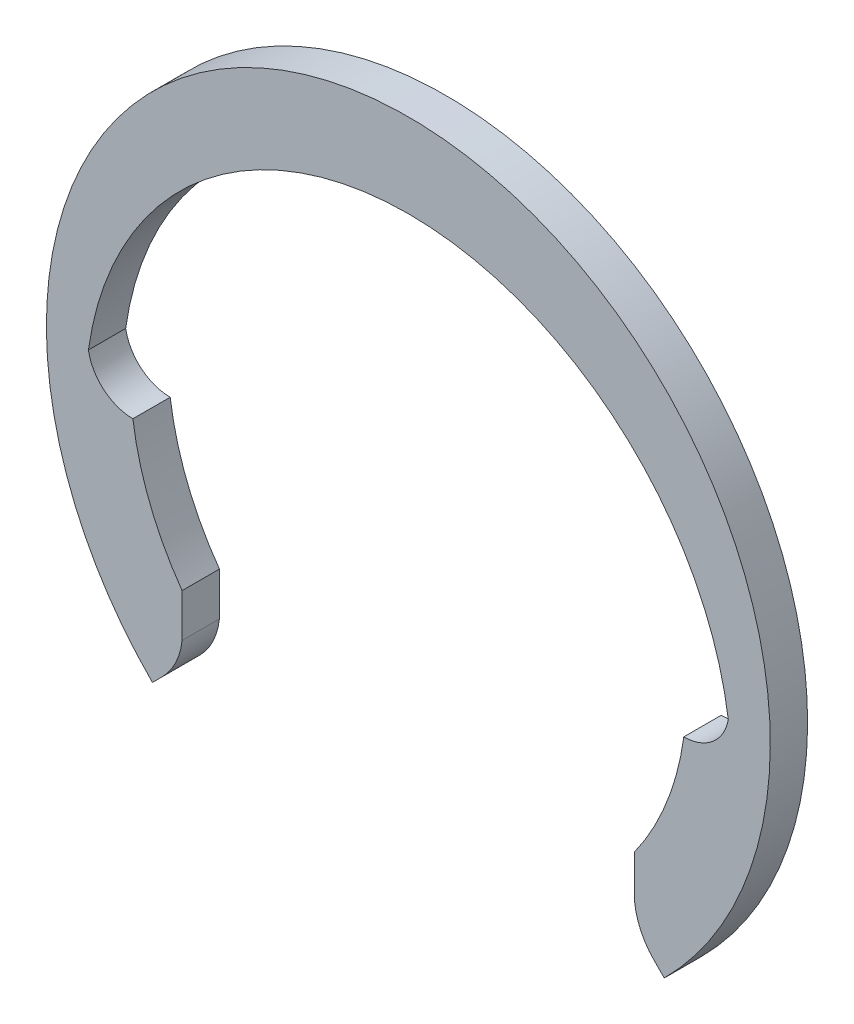
ISO-10303-21;
HEADER;
FILE_DESCRIPTION(('STEP AP214'),'2;1');
FILE_NAME('part.step','',(''),(''),'','','');
FILE_SCHEMA(('AUTOMOTIVE_DESIGN { 1 0 10303 214 1 1 1 1 }'));
ENDSEC;
DATA;
#1=APPLICATION_CONTEXT('core data for automotive mechanical design processes');
#2=APPLICATION_PROTOCOL_DEFINITION('international standard','automotive_design',2000,#1);
#3=PRODUCT_CONTEXT('',#1,'mechanical');
#4=PRODUCT('Part','Part','',(#3));
#5=PRODUCT_RELATED_PRODUCT_CATEGORY('part','',(#4));
#6=PRODUCT_DEFINITION_FORMATION('','',#4);
#7=PRODUCT_DEFINITION_CONTEXT('part definition',#1,'design');
#8=PRODUCT_DEFINITION('design','',#6,#7);
#9=PRODUCT_DEFINITION_SHAPE('','',#8);
#10=(LENGTH_UNIT() NAMED_UNIT(*) SI_UNIT(.MILLI.,.METRE.));
#11=(NAMED_UNIT(*) PLANE_ANGLE_UNIT() SI_UNIT($,.RADIAN.));
#12=(NAMED_UNIT(*) SI_UNIT($,.STERADIAN.) SOLID_ANGLE_UNIT());
#13=UNCERTAINTY_MEASURE_WITH_UNIT(LENGTH_MEASURE(1.E-05),#10,'distance_accuracy_value','');
#14=(GEOMETRIC_REPRESENTATION_CONTEXT(3) GLOBAL_UNCERTAINTY_ASSIGNED_CONTEXT((#13)) GLOBAL_UNIT_ASSIGNED_CONTEXT((#10,
#11,#12)) REPRESENTATION_CONTEXT('',''));
#15=CARTESIAN_POINT('',(0.,0.,0.));
#16=DIRECTION('',(0.,0.,1.));
#17=DIRECTION('',(1.,0.,0.));
#18=AXIS2_PLACEMENT_3D('',#15,#16,#17);
#19=CARTESIAN_POINT('',(-7.38258084954035,0.210931715191452,1.));
#20=DIRECTION('',(0.,0.,-1.));
#21=DIRECTION('',(-1.,0.,0.));
#22=AXIS2_PLACEMENT_3D('',#19,#20,#21);
#23=CYLINDRICAL_SURFACE('',#22,1.21093171519145);
#24=CARTESIAN_POINT('',(-7.38258084954035,0.210931715191452,0.));
#25=DIRECTION('',(0.,0.,-1.));
#26=DIRECTION('',(1.,0.,0.));
#27=AXIS2_PLACEMENT_3D('',#24,#25,#26);
#28=CIRCLE('',#27,1.21093171519145);
#29=CARTESIAN_POINT('',(-7.38258084954035,-0.999999999999998,0.));
#30=VERTEX_POINT('',#29);
#31=CARTESIAN_POINT('',(-8.575,0.,0.));
#32=VERTEX_POINT('',#31);
#33=EDGE_CURVE('E154',#30,#32,#28,.T.);
#34=ORIENTED_EDGE('',*,*,#33,.T.);
#35=DIRECTION('',(0.,0.,-1.));
#36=VECTOR('',#35,1.);
#37=CARTESIAN_POINT('',(-8.575,0.,1.));
#38=LINE('',#37,#36);
#39=CARTESIAN_POINT('',(-8.575,0.,1.));
#40=VERTEX_POINT('',#39);
#41=EDGE_CURVE('E11',#40,#32,#38,.T.);
#42=ORIENTED_EDGE('',*,*,#41,.F.);
#43=CARTESIAN_POINT('',(-7.38258084954035,0.210931715191452,1.));
#44=DIRECTION('',(0.,0.,-1.));
#45=DIRECTION('',(1.,0.,0.));
#46=AXIS2_PLACEMENT_3D('',#43,#44,#45);
#47=CIRCLE('',#46,1.21093171519145);
#48=CARTESIAN_POINT('',(-7.38258084954035,-0.999999999999998,1.));
#49=VERTEX_POINT('',#48);
#50=EDGE_CURVE('E177',#49,#40,#47,.T.);
#51=ORIENTED_EDGE('',*,*,#50,.F.);
#52=DIRECTION('',(0.,0.,-1.));
#53=VECTOR('',#52,1.);
#54=CARTESIAN_POINT('',(-7.38258084954035,-0.999999999999998,1.));
#55=LINE('',#54,#53);
#56=EDGE_CURVE('E150',#49,#30,#55,.T.);
#57=ORIENTED_EDGE('',*,*,#56,.T.);
#58=EDGE_LOOP('',(#34,#42,#51,#57));
#59=FACE_BOUND('',#58,.T.);
#60=ADVANCED_FACE('F34',(#59),#23,.F.);
#61=CARTESIAN_POINT('',(0.,-1.20994127516779,1.));
#62=DIRECTION('',(0.,0.,-1.));
#63=DIRECTION('',(-1.,0.,0.));
#64=AXIS2_PLACEMENT_3D('',#61,#62,#63);
#65=CYLINDRICAL_SURFACE('',#64,8.65994127516779);
#66=CARTESIAN_POINT('',(0.,-1.20994127516779,0.));
#67=DIRECTION('',(0.,0.,-1.));
#68=DIRECTION('',(1.,0.,0.));
#69=AXIS2_PLACEMENT_3D('',#66,#67,#68);
#70=CIRCLE('',#69,8.65994127516779);
#71=CARTESIAN_POINT('',(8.575,0.,0.));
#72=VERTEX_POINT('',#71);
#73=EDGE_CURVE('E157',#32,#72,#70,.T.);
#74=ORIENTED_EDGE('',*,*,#73,.T.);
#75=DIRECTION('',(0.,0.,-1.));
#76=VECTOR('',#75,1.);
#77=CARTESIAN_POINT('',(8.575,0.,1.));
#78=LINE('',#77,#76);
#79=CARTESIAN_POINT('',(8.575,0.,1.));
#80=VERTEX_POINT('',#79);
#81=EDGE_CURVE('E42',#80,#72,#78,.T.);
#82=ORIENTED_EDGE('',*,*,#81,.F.);
#83=CARTESIAN_POINT('',(0.,-1.20994127516779,1.));
#84=DIRECTION('',(0.,0.,-1.));
#85=DIRECTION('',(1.,0.,0.));
#86=AXIS2_PLACEMENT_3D('',#83,#84,#85);
#87=CIRCLE('',#86,8.65994127516779);
#88=EDGE_CURVE('E104',#40,#80,#87,.T.);
#89=ORIENTED_EDGE('',*,*,#88,.F.);
#90=ORIENTED_EDGE('',*,*,#41,.T.);
#91=EDGE_LOOP('',(#74,#82,#89,#90));
#92=FACE_BOUND('',#91,.T.);
#93=ADVANCED_FACE('F254',(#92),#65,.F.);
#94=CARTESIAN_POINT('',(7.38258084954036,0.210931715191454,1.));
#95=DIRECTION('',(0.,0.,-1.));
#96=DIRECTION('',(-1.,0.,0.));
#97=AXIS2_PLACEMENT_3D('',#94,#95,#96);
#98=CYLINDRICAL_SURFACE('',#97,1.21093171519145);
#99=CARTESIAN_POINT('',(7.38258084954036,0.210931715191454,0.));
#100=DIRECTION('',(0.,0.,-1.));
#101=DIRECTION('',(-1.,0.,0.));
#102=AXIS2_PLACEMENT_3D('',#99,#100,#101);
#103=CIRCLE('',#102,1.21093171519145);
#104=CARTESIAN_POINT('',(7.38258084954036,-0.999999999999998,0.));
#105=VERTEX_POINT('',#104);
#106=EDGE_CURVE('E159',#72,#105,#103,.T.);
#107=ORIENTED_EDGE('',*,*,#106,.T.);
#108=DIRECTION('',(0.,0.,-1.));
#109=VECTOR('',#108,1.);
#110=CARTESIAN_POINT('',(7.38258084954036,-0.999999999999998,1.));
#111=LINE('',#110,#109);
#112=CARTESIAN_POINT('',(7.38258084954036,-0.999999999999998,1.));
#113=VERTEX_POINT('',#112);
#114=EDGE_CURVE('E196',#113,#105,#111,.T.);
#115=ORIENTED_EDGE('',*,*,#114,.F.);
#116=CARTESIAN_POINT('',(7.38258084954036,0.210931715191454,1.));
#117=DIRECTION('',(0.,0.,-1.));
#118=DIRECTION('',(-1.,0.,0.));
#119=AXIS2_PLACEMENT_3D('',#116,#117,#118);
#120=CIRCLE('',#119,1.21093171519145);
#121=EDGE_CURVE('E204',#80,#113,#120,.T.);
#122=ORIENTED_EDGE('',*,*,#121,.F.);
#123=ORIENTED_EDGE('',*,*,#81,.T.);
#124=EDGE_LOOP('',(#107,#115,#122,#123));
#125=FACE_BOUND('',#124,.T.);
#126=ADVANCED_FACE('F202',(#125),#98,.F.);
#127=CARTESIAN_POINT('',(0.,0.,1.));
#128=DIRECTION('',(0.,0.,-1.));
#129=DIRECTION('',(-1.,0.,0.));
#130=AXIS2_PLACEMENT_3D('',#127,#128,#129);
#131=CYLINDRICAL_SURFACE('',#130,7.45);
#132=CARTESIAN_POINT('',(0.,0.,0.));
#133=DIRECTION('',(0.,0.,-1.));
#134=DIRECTION('',(-1.,0.,0.));
#135=AXIS2_PLACEMENT_3D('',#132,#133,#134);
#136=CIRCLE('',#135,7.45);
#137=CARTESIAN_POINT('',(6.06344064867466,-4.32864730602989,0.));
#138=VERTEX_POINT('',#137);
#139=EDGE_CURVE('E161',#105,#138,#136,.T.);
#140=ORIENTED_EDGE('',*,*,#139,.T.);
#141=DIRECTION('',(0.,0.,-1.));
#142=VECTOR('',#141,1.);
#143=CARTESIAN_POINT('',(6.06344064867466,-4.32864730602989,1.));
#144=LINE('',#143,#142);
#145=CARTESIAN_POINT('',(6.06344064867466,-4.32864730602989,1.));
#146=VERTEX_POINT('',#145);
#147=EDGE_CURVE('E193',#146,#138,#144,.T.);
#148=ORIENTED_EDGE('',*,*,#147,.F.);
#149=CARTESIAN_POINT('',(0.,0.,1.));
#150=DIRECTION('',(0.,0.,-1.));
#151=DIRECTION('',(-1.,0.,0.));
#152=AXIS2_PLACEMENT_3D('',#149,#150,#151);
#153=CIRCLE('',#152,7.45);
#154=EDGE_CURVE('E221',#113,#146,#153,.T.);
#155=ORIENTED_EDGE('',*,*,#154,.F.);
#156=ORIENTED_EDGE('',*,*,#114,.T.);
#157=EDGE_LOOP('',(#140,#148,#155,#156));
#158=FACE_BOUND('',#157,.T.);
#159=ADVANCED_FACE('F212',(#158),#131,.F.);
#160=CARTESIAN_POINT('',(6.06344064867466,-5.48517620112639,1.));
#161=DIRECTION('',(1.,0.,0.));
#162=DIRECTION('',(0.,0.,-1.));
#163=AXIS2_PLACEMENT_3D('',#160,#161,#162);
#164=PLANE('',#163);
#165=DIRECTION('',(0.,-1.,0.));
#166=VECTOR('',#165,1.);
#167=CARTESIAN_POINT('',(6.06344064867466,-5.48517620112639,0.));
#168=LINE('',#167,#166);
#169=CARTESIAN_POINT('',(6.06344064867466,-5.48517620112639,0.));
#170=VERTEX_POINT('',#169);
#171=EDGE_CURVE('E164',#138,#170,#168,.T.);
#172=ORIENTED_EDGE('',*,*,#171,.T.);
#173=DIRECTION('',(0.,0.,-1.));
#174=VECTOR('',#173,1.);
#175=CARTESIAN_POINT('',(6.06344064867466,-5.48517620112639,1.));
#176=LINE('',#175,#174);
#177=CARTESIAN_POINT('',(6.06344064867466,-5.48517620112639,1.));
#178=VERTEX_POINT('',#177);
#179=EDGE_CURVE('E190',#178,#170,#176,.T.);
#180=ORIENTED_EDGE('',*,*,#179,.F.);
#181=DIRECTION('',(0.,-1.,0.));
#182=VECTOR('',#181,1.);
#183=CARTESIAN_POINT('',(6.06344064867466,-4.90691175357814,1.));
#184=LINE('',#183,#182);
#185=EDGE_CURVE('E218',#146,#178,#184,.T.);
#186=ORIENTED_EDGE('',*,*,#185,.F.);
#187=ORIENTED_EDGE('',*,*,#147,.T.);
#188=EDGE_LOOP('',(#172,#180,#186,#187));
#189=FACE_BOUND('',#188,.T.);
#190=ADVANCED_FACE('F216',(#189),#164,.F.);
#191=CARTESIAN_POINT('',(7.89960221527562,-5.28793925385349,1.));
#192=DIRECTION('',(0.,0.,-1.));
#193=DIRECTION('',(-1.,0.,0.));
#194=AXIS2_PLACEMENT_3D('',#191,#192,#193);
#195=CYLINDRICAL_SURFACE('',#194,1.84672459019531);
#196=CARTESIAN_POINT('',(7.89960221527562,-5.28793925385349,0.));
#197=DIRECTION('',(0.,0.,1.));
#198=DIRECTION('',(1.,0.,0.));
#199=AXIS2_PLACEMENT_3D('',#196,#197,#198);
#200=CIRCLE('',#199,1.84672459019531);
#201=CARTESIAN_POINT('',(6.59377073456457,-6.59377073456454,0.));
#202=VERTEX_POINT('',#201);
#203=EDGE_CURVE('E166',#170,#202,#200,.T.);
#204=ORIENTED_EDGE('',*,*,#203,.T.);
#205=DIRECTION('',(0.,0.,-1.));
#206=VECTOR('',#205,1.);
#207=CARTESIAN_POINT('',(6.59377073456457,-6.59377073456454,1.));
#208=LINE('',#207,#206);
#209=CARTESIAN_POINT('',(6.59377073456457,-6.59377073456454,1.));
#210=VERTEX_POINT('',#209);
#211=EDGE_CURVE('E187',#210,#202,#208,.T.);
#212=ORIENTED_EDGE('',*,*,#211,.F.);
#213=CARTESIAN_POINT('',(7.89960221527562,-5.28793925385349,1.));
#214=DIRECTION('',(0.,0.,1.));
#215=DIRECTION('',(1.,0.,0.));
#216=AXIS2_PLACEMENT_3D('',#213,#214,#215);
#217=CIRCLE('',#216,1.84672459019531);
#218=EDGE_CURVE('E220',#178,#210,#217,.T.);
#219=ORIENTED_EDGE('',*,*,#218,.F.);
#220=ORIENTED_EDGE('',*,*,#179,.T.);
#221=EDGE_LOOP('',(#204,#212,#219,#220));
#222=FACE_BOUND('',#221,.T.);
#223=ADVANCED_FACE('F267',(#222),#195,.T.);
#224=CARTESIAN_POINT('',(6.59377073456457,-6.59377073456454,1.));
#225=DIRECTION('',(0.707106781186547,0.707106781186547,0.));
#226=DIRECTION('',(-0.707106781186548,0.707106781186548,0.));
#227=AXIS2_PLACEMENT_3D('',#224,#225,#226);
#228=PLANE('',#227);
#229=DIRECTION('',(0.707106781186548,-0.707106781186548,0.));
#230=VECTOR('',#229,1.);
#231=CARTESIAN_POINT('',(6.59377073456457,-6.59377073456454,0.));
#232=LINE('',#231,#230);
#233=CARTESIAN_POINT('',(6.85893577750952,-6.8589357775095,0.));
#234=VERTEX_POINT('',#233);
#235=EDGE_CURVE('E168',#202,#234,#232,.T.);
#236=ORIENTED_EDGE('',*,*,#235,.T.);
#237=DIRECTION('',(0.,0.,-1.));
#238=VECTOR('',#237,1.);
#239=CARTESIAN_POINT('',(6.85893577750952,-6.8589357775095,1.));
#240=LINE('',#239,#238);
#241=CARTESIAN_POINT('',(6.85893577750952,-6.8589357775095,1.));
#242=VERTEX_POINT('',#241);
#243=EDGE_CURVE('E184',#242,#234,#240,.T.);
#244=ORIENTED_EDGE('',*,*,#243,.F.);
#245=DIRECTION('',(0.707106781186548,-0.707106781186548,0.));
#246=VECTOR('',#245,1.);
#247=CARTESIAN_POINT('',(6.59377073456457,-6.59377073456454,1.));
#248=LINE('',#247,#246);
#249=EDGE_CURVE('E223',#210,#242,#248,.T.);
#250=ORIENTED_EDGE('',*,*,#249,.F.);
#251=ORIENTED_EDGE('',*,*,#211,.T.);
#252=EDGE_LOOP('',(#236,#244,#250,#251));
#253=FACE_BOUND('',#252,.T.);
#254=ADVANCED_FACE('F270',(#253),#228,.F.);
#255=CARTESIAN_POINT('',(0.,0.,1.));
#256=DIRECTION('',(0.,0.,-1.));
#257=DIRECTION('',(-1.,0.,0.));
#258=AXIS2_PLACEMENT_3D('',#255,#256,#257);
#259=CYLINDRICAL_SURFACE('',#258,9.7);
#260=CARTESIAN_POINT('',(0.,0.,0.));
#261=DIRECTION('',(0.,0.,1.));
#262=DIRECTION('',(1.,0.,0.));
#263=AXIS2_PLACEMENT_3D('',#260,#261,#262);
#264=CIRCLE('',#263,9.7);
#265=CARTESIAN_POINT('',(-6.85893577750952,-6.8589357775095,0.));
#266=VERTEX_POINT('',#265);
#267=EDGE_CURVE('E170',#234,#266,#264,.T.);
#268=ORIENTED_EDGE('',*,*,#267,.T.);
#269=DIRECTION('',(0.,0.,-1.));
#270=VECTOR('',#269,1.);
#271=CARTESIAN_POINT('',(-6.85893577750952,-6.8589357775095,1.));
#272=LINE('',#271,#270);
#273=CARTESIAN_POINT('',(-6.85893577750952,-6.8589357775095,1.));
#274=VERTEX_POINT('',#273);
#275=EDGE_CURVE('E181',#274,#266,#272,.T.);
#276=ORIENTED_EDGE('',*,*,#275,.F.);
#277=CARTESIAN_POINT('',(0.,0.,1.));
#278=DIRECTION('',(0.,0.,1.));
#279=DIRECTION('',(1.,0.,0.));
#280=AXIS2_PLACEMENT_3D('',#277,#278,#279);
#281=CIRCLE('',#280,9.7);
#282=EDGE_CURVE('E229',#242,#274,#281,.T.);
#283=ORIENTED_EDGE('',*,*,#282,.F.);
#284=ORIENTED_EDGE('',*,*,#243,.T.);
#285=EDGE_LOOP('',(#268,#276,#283,#284));
#286=FACE_BOUND('',#285,.T.);
#287=ADVANCED_FACE('F235',(#286),#259,.T.);
#288=CARTESIAN_POINT('',(-6.59377073456456,-6.59377073456454,1.));
#289=DIRECTION('',(-0.707106781186547,0.707106781186547,0.));
#290=DIRECTION('',(-0.707106781186548,-0.707106781186548,0.));
#291=AXIS2_PLACEMENT_3D('',#288,#289,#290);
#292=PLANE('',#291);
#293=DIRECTION('',(0.707106781186548,0.707106781186548,0.));
#294=VECTOR('',#293,1.);
#295=CARTESIAN_POINT('',(-6.59377073456456,-6.59377073456454,0.));
#296=LINE('',#295,#294);
#297=CARTESIAN_POINT('',(-6.59377073456456,-6.59377073456454,0.));
#298=VERTEX_POINT('',#297);
#299=EDGE_CURVE('E172',#266,#298,#296,.T.);
#300=ORIENTED_EDGE('',*,*,#299,.T.);
#301=DIRECTION('',(0.,0.,-1.));
#302=VECTOR('',#301,1.);
#303=CARTESIAN_POINT('',(-6.59377073456456,-6.59377073456454,1.));
#304=LINE('',#303,#302);
#305=CARTESIAN_POINT('',(-6.59377073456456,-6.59377073456454,1.));
#306=VERTEX_POINT('',#305);
#307=EDGE_CURVE('E145',#306,#298,#304,.T.);
#308=ORIENTED_EDGE('',*,*,#307,.F.);
#309=DIRECTION('',(0.707106781186548,0.707106781186548,0.));
#310=VECTOR('',#309,1.);
#311=CARTESIAN_POINT('',(-6.59377073456456,-6.59377073456454,1.));
#312=LINE('',#311,#310);
#313=EDGE_CURVE('E135',#274,#306,#312,.T.);
#314=ORIENTED_EDGE('',*,*,#313,.F.);
#315=ORIENTED_EDGE('',*,*,#275,.T.);
#316=EDGE_LOOP('',(#300,#308,#314,#315));
#317=FACE_BOUND('',#316,.T.);
#318=ADVANCED_FACE('F239',(#317),#292,.F.);
#319=CARTESIAN_POINT('',(-7.89960221527562,-5.28793925385349,1.));
#320=DIRECTION('',(0.,0.,-1.));
#321=DIRECTION('',(-1.,0.,0.));
#322=AXIS2_PLACEMENT_3D('',#319,#320,#321);
#323=CYLINDRICAL_SURFACE('',#322,1.84672459019531);
#324=CARTESIAN_POINT('',(-7.89960221527562,-5.28793925385349,0.));
#325=DIRECTION('',(0.,0.,1.));
#326=DIRECTION('',(-1.,0.,0.));
#327=AXIS2_PLACEMENT_3D('',#324,#325,#326);
#328=CIRCLE('',#327,1.84672459019531);
#329=CARTESIAN_POINT('',(-6.06344064867465,-5.48517620112639,0.));
#330=VERTEX_POINT('',#329);
#331=EDGE_CURVE('E144',#298,#330,#328,.T.);
#332=ORIENTED_EDGE('',*,*,#331,.T.);
#333=DIRECTION('',(0.,0.,-1.));
#334=VECTOR('',#333,1.);
#335=CARTESIAN_POINT('',(-6.06344064867465,-5.48517620112639,1.));
#336=LINE('',#335,#334);
#337=CARTESIAN_POINT('',(-6.06344064867465,-5.48517620112639,1.));
#338=VERTEX_POINT('',#337);
#339=EDGE_CURVE('E141',#338,#330,#336,.T.);
#340=ORIENTED_EDGE('',*,*,#339,.F.);
#341=CARTESIAN_POINT('',(-7.89960221527562,-5.28793925385349,1.));
#342=DIRECTION('',(0.,0.,1.));
#343=DIRECTION('',(-1.,0.,0.));
#344=AXIS2_PLACEMENT_3D('',#341,#342,#343);
#345=CIRCLE('',#344,1.84672459019531);
#346=EDGE_CURVE('E129',#306,#338,#345,.T.);
#347=ORIENTED_EDGE('',*,*,#346,.F.);
#348=ORIENTED_EDGE('',*,*,#307,.T.);
#349=EDGE_LOOP('',(#332,#340,#347,#348));
#350=FACE_BOUND('',#349,.T.);
#351=ADVANCED_FACE('F142',(#350),#323,.T.);
#352=CARTESIAN_POINT('',(-6.06344064867465,-4.90691175357814,1.));
#353=DIRECTION('',(-1.,0.,0.));
#354=DIRECTION('',(0.,0.,1.));
#355=AXIS2_PLACEMENT_3D('',#352,#353,#354);
#356=PLANE('',#355);
#357=DIRECTION('',(0.,1.,0.));
#358=VECTOR('',#357,1.);
#359=CARTESIAN_POINT('',(-6.06344064867465,-4.90691175357814,0.));
#360=LINE('',#359,#358);
#361=CARTESIAN_POINT('',(-6.06344064867465,-4.3286473060299,0.));
#362=VERTEX_POINT('',#361);
#363=EDGE_CURVE('E90',#330,#362,#360,.T.);
#364=ORIENTED_EDGE('',*,*,#363,.T.);
#365=DIRECTION('',(0.,0.,-1.));
#366=VECTOR('',#365,1.);
#367=CARTESIAN_POINT('',(-6.06344064867465,-4.3286473060299,1.));
#368=LINE('',#367,#366);
#369=CARTESIAN_POINT('',(-6.06344064867465,-4.3286473060299,1.));
#370=VERTEX_POINT('',#369);
#371=EDGE_CURVE('E146',#370,#362,#368,.T.);
#372=ORIENTED_EDGE('',*,*,#371,.F.);
#373=DIRECTION('',(0.,1.,0.));
#374=VECTOR('',#373,1.);
#375=CARTESIAN_POINT('',(-6.06344064867465,-5.48517620112639,1.));
#376=LINE('',#375,#374);
#377=EDGE_CURVE('E133',#338,#370,#376,.T.);
#378=ORIENTED_EDGE('',*,*,#377,.F.);
#379=ORIENTED_EDGE('',*,*,#339,.T.);
#380=EDGE_LOOP('',(#364,#372,#378,#379));
#381=FACE_BOUND('',#380,.T.);
#382=ADVANCED_FACE('F148',(#381),#356,.F.);
#383=CARTESIAN_POINT('',(0.,0.,1.));
#384=DIRECTION('',(0.,0.,-1.));
#385=DIRECTION('',(-1.,0.,0.));
#386=AXIS2_PLACEMENT_3D('',#383,#384,#385);
#387=CYLINDRICAL_SURFACE('',#386,7.45);
#388=CARTESIAN_POINT('',(0.,0.,0.));
#389=DIRECTION('',(0.,0.,-1.));
#390=DIRECTION('',(1.,0.,0.));
#391=AXIS2_PLACEMENT_3D('',#388,#389,#390);
#392=CIRCLE('',#391,7.45);
#393=EDGE_CURVE('E96',#362,#30,#392,.T.);
#394=ORIENTED_EDGE('',*,*,#393,.T.);
#395=ORIENTED_EDGE('',*,*,#56,.F.);
#396=CARTESIAN_POINT('',(0.,0.,1.));
#397=DIRECTION('',(0.,0.,-1.));
#398=DIRECTION('',(1.,0.,0.));
#399=AXIS2_PLACEMENT_3D('',#396,#397,#398);
#400=CIRCLE('',#399,7.45);
#401=EDGE_CURVE('E50',#370,#49,#400,.T.);
#402=ORIENTED_EDGE('',*,*,#401,.F.);
#403=ORIENTED_EDGE('',*,*,#371,.T.);
#404=EDGE_LOOP('',(#394,#395,#402,#403));
#405=FACE_BOUND('',#404,.T.);
#406=ADVANCED_FACE('F243',(#405),#387,.F.);
#407=CARTESIAN_POINT('',(-7.38258084954035,0.210931715191452,1.));
#408=DIRECTION('',(0.,0.,1.));
#409=DIRECTION('',(1.,0.,0.));
#410=AXIS2_PLACEMENT_3D('',#407,#408,#409);
#411=PLANE('',#410);
#412=ORIENTED_EDGE('',*,*,#50,.T.);
#413=ORIENTED_EDGE('',*,*,#88,.T.);
#414=ORIENTED_EDGE('',*,*,#121,.T.);
#415=ORIENTED_EDGE('',*,*,#154,.T.);
#416=ORIENTED_EDGE('',*,*,#185,.T.);
#417=ORIENTED_EDGE('',*,*,#218,.T.);
#418=ORIENTED_EDGE('',*,*,#249,.T.);
#419=ORIENTED_EDGE('',*,*,#282,.T.);
#420=ORIENTED_EDGE('',*,*,#313,.T.);
#421=ORIENTED_EDGE('',*,*,#346,.T.);
#422=ORIENTED_EDGE('',*,*,#377,.T.);
#423=ORIENTED_EDGE('',*,*,#401,.T.);
#424=EDGE_LOOP('',(#412,#413,#414,#415,#416,#417,#418,#419,#420,#421,#422,#423));
#425=FACE_BOUND('',#424,.T.);
#426=ADVANCED_FACE('F131',(#425),#411,.T.);
#427=CARTESIAN_POINT('',(-7.38258084954035,0.210931715191452,0.));
#428=DIRECTION('',(0.,0.,1.));
#429=DIRECTION('',(1.,0.,0.));
#430=AXIS2_PLACEMENT_3D('',#427,#428,#429);
#431=PLANE('',#430);
#432=ORIENTED_EDGE('',*,*,#33,.F.);
#433=ORIENTED_EDGE('',*,*,#393,.F.);
#434=ORIENTED_EDGE('',*,*,#363,.F.);
#435=ORIENTED_EDGE('',*,*,#331,.F.);
#436=ORIENTED_EDGE('',*,*,#299,.F.);
#437=ORIENTED_EDGE('',*,*,#267,.F.);
#438=ORIENTED_EDGE('',*,*,#235,.F.);
#439=ORIENTED_EDGE('',*,*,#203,.F.);
#440=ORIENTED_EDGE('',*,*,#171,.F.);
#441=ORIENTED_EDGE('',*,*,#139,.F.);
#442=ORIENTED_EDGE('',*,*,#106,.F.);
#443=ORIENTED_EDGE('',*,*,#73,.F.);
#444=EDGE_LOOP('',(#432,#433,#434,#435,#436,#437,#438,#439,#440,#441,#442,#443));
#445=FACE_BOUND('',#444,.T.);
#446=ADVANCED_FACE('F208',(#445),#431,.F.);
#447=CLOSED_SHELL('',(#60,#93,#126,#159,#190,#223,#254,#287,#318,#351,#382,#406,#426,#446));
#448=MANIFOLD_SOLID_BREP('B2',#447);
#449=ADVANCED_BREP_SHAPE_REPRESENTATION('',(#18,#448),#14);
#450=SHAPE_DEFINITION_REPRESENTATION(#9,#449);
ENDSEC;
END-ISO-10303-21;
